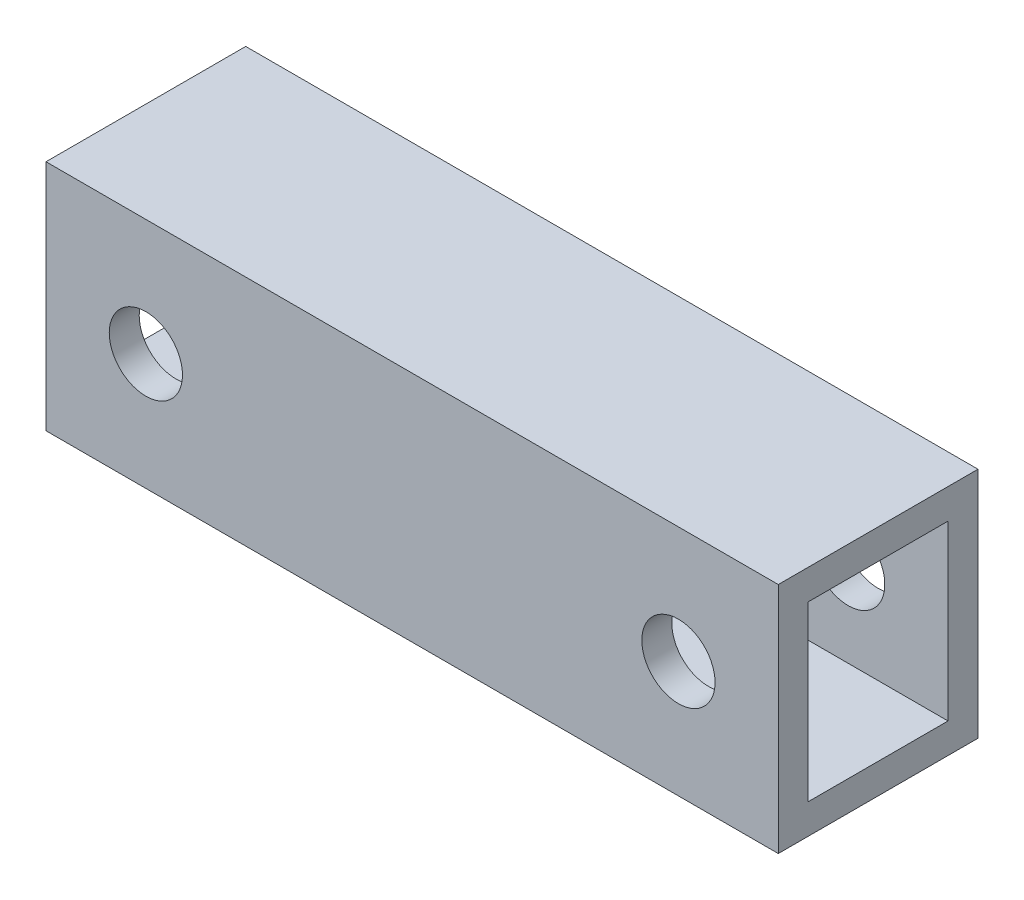
ISO-10303-21;
HEADER;
FILE_DESCRIPTION(('STEP AP214'),'2;1');
FILE_NAME('part.step','',(''),(''),'','','');
FILE_SCHEMA(('AUTOMOTIVE_DESIGN { 1 0 10303 214 1 1 1 1 }'));
ENDSEC;
DATA;
#1=APPLICATION_CONTEXT('core data for automotive mechanical design processes');
#2=APPLICATION_PROTOCOL_DEFINITION('international standard','automotive_design',2000,#1);
#3=PRODUCT_CONTEXT('',#1,'mechanical');
#4=PRODUCT('Part','Part','',(#3));
#5=PRODUCT_RELATED_PRODUCT_CATEGORY('part','',(#4));
#6=PRODUCT_DEFINITION_FORMATION('','',#4);
#7=PRODUCT_DEFINITION_CONTEXT('part definition',#1,'design');
#8=PRODUCT_DEFINITION('design','',#6,#7);
#9=PRODUCT_DEFINITION_SHAPE('','',#8);
#10=(LENGTH_UNIT() NAMED_UNIT(*) SI_UNIT(.MILLI.,.METRE.));
#11=(NAMED_UNIT(*) PLANE_ANGLE_UNIT() SI_UNIT($,.RADIAN.));
#12=(NAMED_UNIT(*) SI_UNIT($,.STERADIAN.) SOLID_ANGLE_UNIT());
#13=UNCERTAINTY_MEASURE_WITH_UNIT(LENGTH_MEASURE(1.E-05),#10,'distance_accuracy_value','');
#14=(GEOMETRIC_REPRESENTATION_CONTEXT(3) GLOBAL_UNCERTAINTY_ASSIGNED_CONTEXT((#13)) GLOBAL_UNIT_ASSIGNED_CONTEXT((#10,
#11,#12)) REPRESENTATION_CONTEXT('',''));
#15=CARTESIAN_POINT('',(0.,0.,0.));
#16=DIRECTION('',(0.,0.,1.));
#17=DIRECTION('',(1.,0.,0.));
#18=AXIS2_PLACEMENT_3D('',#15,#16,#17);
#19=CARTESIAN_POINT('',(54.,-17.,5.));
#20=DIRECTION('',(1.,0.,0.));
#21=DIRECTION('',(0.,0.,-1.));
#22=AXIS2_PLACEMENT_3D('',#19,#20,#21);
#23=PLANE('',#22);
#24=DIRECTION('',(0.,-1.,0.));
#25=VECTOR('',#24,1.);
#26=CARTESIAN_POINT('',(54.,-17.,-1.));
#27=LINE('',#26,#25);
#28=CARTESIAN_POINT('',(54.,-10.,-1.));
#29=VERTEX_POINT('',#28);
#30=CARTESIAN_POINT('',(54.,-17.,-1.));
#31=VERTEX_POINT('',#30);
#32=EDGE_CURVE('E163',#29,#31,#27,.T.);
#33=ORIENTED_EDGE('',*,*,#32,.T.);
#34=DIRECTION('',(0.,0.,-1.));
#35=VECTOR('',#34,1.);
#36=CARTESIAN_POINT('',(54.,-17.,5.));
#37=LINE('',#36,#35);
#38=CARTESIAN_POINT('',(54.,-17.,5.));
#39=VERTEX_POINT('',#38);
#40=EDGE_CURVE('E112',#39,#31,#37,.T.);
#41=ORIENTED_EDGE('',*,*,#40,.F.);
#42=DIRECTION('',(0.,-1.,0.));
#43=VECTOR('',#42,1.);
#44=CARTESIAN_POINT('',(54.,-17.,5.));
#45=LINE('',#44,#43);
#46=CARTESIAN_POINT('',(54.,-10.,5.));
#47=VERTEX_POINT('',#46);
#48=EDGE_CURVE('E164',#47,#39,#45,.T.);
#49=ORIENTED_EDGE('',*,*,#48,.F.);
#50=DIRECTION('',(0.,0.,-1.));
#51=VECTOR('',#50,1.);
#52=CARTESIAN_POINT('',(54.,-10.,5.));
#53=LINE('',#52,#51);
#54=EDGE_CURVE('E173',#47,#29,#53,.T.);
#55=ORIENTED_EDGE('',*,*,#54,.T.);
#56=EDGE_LOOP('',(#33,#41,#49,#55));
#57=FACE_BOUND('',#56,.T.);
#58=DIRECTION('',(0.,1.,0.));
#59=VECTOR('',#58,1.);
#60=CARTESIAN_POINT('',(54.,-17.,4.1));
#61=LINE('',#60,#59);
#62=CARTESIAN_POINT('',(54.,-16.1,4.1));
#63=VERTEX_POINT('',#62);
#64=CARTESIAN_POINT('',(54.,-10.9,4.1));
#65=VERTEX_POINT('',#64);
#66=EDGE_CURVE('E157',#63,#65,#61,.T.);
#67=ORIENTED_EDGE('',*,*,#66,.F.);
#68=DIRECTION('',(0.,0.,1.));
#69=VECTOR('',#68,1.);
#70=CARTESIAN_POINT('',(54.,-16.1,5.));
#71=LINE('',#70,#69);
#72=CARTESIAN_POINT('',(54.,-16.1,-0.1));
#73=VERTEX_POINT('',#72);
#74=EDGE_CURVE('E165',#73,#63,#71,.T.);
#75=ORIENTED_EDGE('',*,*,#74,.F.);
#76=DIRECTION('',(0.,1.,0.));
#77=VECTOR('',#76,1.);
#78=CARTESIAN_POINT('',(54.,-17.,-0.1));
#79=LINE('',#78,#77);
#80=CARTESIAN_POINT('',(54.,-10.9,-0.1));
#81=VERTEX_POINT('',#80);
#82=EDGE_CURVE('E156',#73,#81,#79,.T.);
#83=ORIENTED_EDGE('',*,*,#82,.T.);
#84=DIRECTION('',(0.,0.,-1.));
#85=VECTOR('',#84,1.);
#86=CARTESIAN_POINT('',(54.,-10.9,5.));
#87=LINE('',#86,#85);
#88=EDGE_CURVE('E119',#65,#81,#87,.T.);
#89=ORIENTED_EDGE('',*,*,#88,.F.);
#90=EDGE_LOOP('',(#67,#75,#83,#89));
#91=FACE_BOUND('',#90,.T.);
#92=ADVANCED_FACE('F43',(#57,#91),#23,.F.);
#93=CARTESIAN_POINT('',(76.,-17.,5.));
#94=DIRECTION('',(-1.,0.,0.));
#95=DIRECTION('',(0.,0.,1.));
#96=AXIS2_PLACEMENT_3D('',#93,#94,#95);
#97=PLANE('',#96);
#98=DIRECTION('',(0.,1.,0.));
#99=VECTOR('',#98,1.);
#100=CARTESIAN_POINT('',(76.,-17.,-1.));
#101=LINE('',#100,#99);
#102=CARTESIAN_POINT('',(76.,-17.,-1.));
#103=VERTEX_POINT('',#102);
#104=CARTESIAN_POINT('',(76.,-10.,-1.));
#105=VERTEX_POINT('',#104);
#106=EDGE_CURVE('E177',#103,#105,#101,.T.);
#107=ORIENTED_EDGE('',*,*,#106,.T.);
#108=DIRECTION('',(0.,0.,-1.));
#109=VECTOR('',#108,1.);
#110=CARTESIAN_POINT('',(76.,-10.,5.));
#111=LINE('',#110,#109);
#112=CARTESIAN_POINT('',(76.,-10.,5.));
#113=VERTEX_POINT('',#112);
#114=EDGE_CURVE('E183',#113,#105,#111,.T.);
#115=ORIENTED_EDGE('',*,*,#114,.F.);
#116=DIRECTION('',(0.,1.,0.));
#117=VECTOR('',#116,1.);
#118=CARTESIAN_POINT('',(76.,-17.,5.));
#119=LINE('',#118,#117);
#120=CARTESIAN_POINT('',(76.,-17.,5.));
#121=VERTEX_POINT('',#120);
#122=EDGE_CURVE('E172',#121,#113,#119,.T.);
#123=ORIENTED_EDGE('',*,*,#122,.F.);
#124=DIRECTION('',(0.,0.,-1.));
#125=VECTOR('',#124,1.);
#126=CARTESIAN_POINT('',(76.,-17.,5.));
#127=LINE('',#126,#125);
#128=EDGE_CURVE('E189',#121,#103,#127,.T.);
#129=ORIENTED_EDGE('',*,*,#128,.T.);
#130=EDGE_LOOP('',(#107,#115,#123,#129));
#131=FACE_BOUND('',#130,.T.);
#132=DIRECTION('',(0.,-1.,0.));
#133=VECTOR('',#132,1.);
#134=CARTESIAN_POINT('',(76.,-17.,4.1));
#135=LINE('',#134,#133);
#136=CARTESIAN_POINT('',(76.,-10.9,4.1));
#137=VERTEX_POINT('',#136);
#138=CARTESIAN_POINT('',(76.,-16.1,4.1));
#139=VERTEX_POINT('',#138);
#140=EDGE_CURVE('E11',#137,#139,#135,.T.);
#141=ORIENTED_EDGE('',*,*,#140,.F.);
#142=DIRECTION('',(0.,0.,1.));
#143=VECTOR('',#142,1.);
#144=CARTESIAN_POINT('',(76.,-10.9,5.));
#145=LINE('',#144,#143);
#146=CARTESIAN_POINT('',(76.,-10.9,-0.1));
#147=VERTEX_POINT('',#146);
#148=EDGE_CURVE('E109',#147,#137,#145,.T.);
#149=ORIENTED_EDGE('',*,*,#148,.F.);
#150=DIRECTION('',(0.,-1.,0.));
#151=VECTOR('',#150,1.);
#152=CARTESIAN_POINT('',(76.,-17.,-0.1));
#153=LINE('',#152,#151);
#154=CARTESIAN_POINT('',(76.,-16.1,-0.1));
#155=VERTEX_POINT('',#154);
#156=EDGE_CURVE('E104',#147,#155,#153,.T.);
#157=ORIENTED_EDGE('',*,*,#156,.T.);
#158=DIRECTION('',(0.,0.,-1.));
#159=VECTOR('',#158,1.);
#160=CARTESIAN_POINT('',(76.,-16.1,5.));
#161=LINE('',#160,#159);
#162=EDGE_CURVE('E51',#139,#155,#161,.T.);
#163=ORIENTED_EDGE('',*,*,#162,.F.);
#164=EDGE_LOOP('',(#141,#149,#157,#163));
#165=FACE_BOUND('',#164,.T.);
#166=ADVANCED_FACE('F125',(#131,#165),#97,.F.);
#167=CARTESIAN_POINT('',(54.,-17.,5.));
#168=DIRECTION('',(0.,1.,0.));
#169=DIRECTION('',(0.,0.,1.));
#170=AXIS2_PLACEMENT_3D('',#167,#168,#169);
#171=PLANE('',#170);
#172=DIRECTION('',(1.,0.,0.));
#173=VECTOR('',#172,1.);
#174=CARTESIAN_POINT('',(54.,-17.,-1.));
#175=LINE('',#174,#173);
#176=EDGE_CURVE('E180',#31,#103,#175,.T.);
#177=ORIENTED_EDGE('',*,*,#176,.T.);
#178=ORIENTED_EDGE('',*,*,#128,.F.);
#179=DIRECTION('',(1.,0.,0.));
#180=VECTOR('',#179,1.);
#181=CARTESIAN_POINT('',(54.,-17.,5.));
#182=LINE('',#181,#180);
#183=EDGE_CURVE('E169',#39,#121,#182,.T.);
#184=ORIENTED_EDGE('',*,*,#183,.F.);
#185=ORIENTED_EDGE('',*,*,#40,.T.);
#186=EDGE_LOOP('',(#177,#178,#184,#185));
#187=FACE_BOUND('',#186,.T.);
#188=ADVANCED_FACE('F195',(#187),#171,.F.);
#189=CARTESIAN_POINT('',(54.,-10.,5.));
#190=DIRECTION('',(0.,-1.,0.));
#191=DIRECTION('',(0.,0.,-1.));
#192=AXIS2_PLACEMENT_3D('',#189,#190,#191);
#193=PLANE('',#192);
#194=DIRECTION('',(-1.,0.,0.));
#195=VECTOR('',#194,1.);
#196=CARTESIAN_POINT('',(54.,-10.,-1.));
#197=LINE('',#196,#195);
#198=EDGE_CURVE('E166',#105,#29,#197,.T.);
#199=ORIENTED_EDGE('',*,*,#198,.T.);
#200=ORIENTED_EDGE('',*,*,#54,.F.);
#201=DIRECTION('',(-1.,0.,0.));
#202=VECTOR('',#201,1.);
#203=CARTESIAN_POINT('',(54.,-10.,5.));
#204=LINE('',#203,#202);
#205=EDGE_CURVE('E174',#113,#47,#204,.T.);
#206=ORIENTED_EDGE('',*,*,#205,.F.);
#207=ORIENTED_EDGE('',*,*,#114,.T.);
#208=EDGE_LOOP('',(#199,#200,#206,#207));
#209=FACE_BOUND('',#208,.T.);
#210=ADVANCED_FACE('F207',(#209),#193,.F.);
#211=CARTESIAN_POINT('',(0.,0.,5.));
#212=DIRECTION('',(0.,0.,-1.));
#213=DIRECTION('',(-1.,0.,0.));
#214=AXIS2_PLACEMENT_3D('',#211,#212,#213);
#215=PLANE('',#214);
#216=CARTESIAN_POINT('',(57.,-13.5,5.));
#217=DIRECTION('',(0.,0.,1.));
#218=DIRECTION('',(1.,0.,0.));
#219=AXIS2_PLACEMENT_3D('',#216,#217,#218);
#220=CIRCLE('',#219,1.1);
#221=CARTESIAN_POINT('',(58.1,-13.5,5.));
#222=VERTEX_POINT('',#221);
#223=EDGE_CURVE('E128',#222,#222,#220,.T.);
#224=ORIENTED_EDGE('',*,*,#223,.F.);
#225=EDGE_LOOP('',(#224));
#226=FACE_BOUND('',#225,.T.);
#227=CARTESIAN_POINT('',(73.,-13.5,5.));
#228=DIRECTION('',(0.,0.,1.));
#229=DIRECTION('',(1.,0.,0.));
#230=AXIS2_PLACEMENT_3D('',#227,#228,#229);
#231=CIRCLE('',#230,1.1);
#232=CARTESIAN_POINT('',(74.1,-13.5,5.));
#233=VERTEX_POINT('',#232);
#234=EDGE_CURVE('E136',#233,#233,#231,.T.);
#235=ORIENTED_EDGE('',*,*,#234,.F.);
#236=EDGE_LOOP('',(#235));
#237=FACE_BOUND('',#236,.T.);
#238=ORIENTED_EDGE('',*,*,#48,.T.);
#239=ORIENTED_EDGE('',*,*,#183,.T.);
#240=ORIENTED_EDGE('',*,*,#122,.T.);
#241=ORIENTED_EDGE('',*,*,#205,.T.);
#242=EDGE_LOOP('',(#238,#239,#240,#241));
#243=FACE_BOUND('',#242,.T.);
#244=ADVANCED_FACE('F211',(#226,#237,#243),#215,.F.);
#245=CARTESIAN_POINT('',(0.,0.,-1.));
#246=DIRECTION('',(0.,0.,-1.));
#247=DIRECTION('',(-1.,0.,0.));
#248=AXIS2_PLACEMENT_3D('',#245,#246,#247);
#249=PLANE('',#248);
#250=CARTESIAN_POINT('',(57.,-13.5,-1.));
#251=DIRECTION('',(0.,0.,-1.));
#252=DIRECTION('',(-1.,0.,0.));
#253=AXIS2_PLACEMENT_3D('',#250,#251,#252);
#254=CIRCLE('',#253,1.1);
#255=CARTESIAN_POINT('',(55.9,-13.5,-1.));
#256=VERTEX_POINT('',#255);
#257=EDGE_CURVE('E149',#256,#256,#254,.F.);
#258=ORIENTED_EDGE('',*,*,#257,.T.);
#259=EDGE_LOOP('',(#258));
#260=FACE_BOUND('',#259,.T.);
#261=CARTESIAN_POINT('',(73.,-13.5,-1.));
#262=DIRECTION('',(0.,0.,-1.));
#263=DIRECTION('',(-1.,0.,0.));
#264=AXIS2_PLACEMENT_3D('',#261,#262,#263);
#265=CIRCLE('',#264,1.1);
#266=CARTESIAN_POINT('',(71.9,-13.5,-1.));
#267=VERTEX_POINT('',#266);
#268=EDGE_CURVE('E131',#267,#267,#265,.F.);
#269=ORIENTED_EDGE('',*,*,#268,.T.);
#270=EDGE_LOOP('',(#269));
#271=FACE_BOUND('',#270,.T.);
#272=ORIENTED_EDGE('',*,*,#32,.F.);
#273=ORIENTED_EDGE('',*,*,#198,.F.);
#274=ORIENTED_EDGE('',*,*,#106,.F.);
#275=ORIENTED_EDGE('',*,*,#176,.F.);
#276=EDGE_LOOP('',(#272,#273,#274,#275));
#277=FACE_BOUND('',#276,.T.);
#278=ADVANCED_FACE('F205',(#260,#271,#277),#249,.T.);
#279=CARTESIAN_POINT('',(53.,-16.1,4.1));
#280=DIRECTION('',(0.,1.,0.));
#281=DIRECTION('',(0.,0.,1.));
#282=AXIS2_PLACEMENT_3D('',#279,#280,#281);
#283=PLANE('',#282);
#284=ORIENTED_EDGE('',*,*,#74,.T.);
#285=DIRECTION('',(1.,0.,0.));
#286=VECTOR('',#285,1.);
#287=CARTESIAN_POINT('',(53.,-16.1,4.1));
#288=LINE('',#287,#286);
#289=EDGE_CURVE('E118',#63,#139,#288,.T.);
#290=ORIENTED_EDGE('',*,*,#289,.T.);
#291=ORIENTED_EDGE('',*,*,#162,.T.);
#292=DIRECTION('',(1.,0.,0.));
#293=VECTOR('',#292,1.);
#294=CARTESIAN_POINT('',(53.,-16.1,-0.1));
#295=LINE('',#294,#293);
#296=EDGE_CURVE('E61',#73,#155,#295,.T.);
#297=ORIENTED_EDGE('',*,*,#296,.F.);
#298=EDGE_LOOP('',(#284,#290,#291,#297));
#299=FACE_BOUND('',#298,.T.);
#300=ADVANCED_FACE('F218',(#299),#283,.T.);
#301=CARTESIAN_POINT('',(53.,-10.9,4.1));
#302=DIRECTION('',(0.,-1.,0.));
#303=DIRECTION('',(0.,0.,-1.));
#304=AXIS2_PLACEMENT_3D('',#301,#302,#303);
#305=PLANE('',#304);
#306=ORIENTED_EDGE('',*,*,#88,.T.);
#307=DIRECTION('',(-1.,0.,0.));
#308=VECTOR('',#307,1.);
#309=CARTESIAN_POINT('',(53.,-10.9,-0.1));
#310=LINE('',#309,#308);
#311=EDGE_CURVE('E56',#147,#81,#310,.T.);
#312=ORIENTED_EDGE('',*,*,#311,.F.);
#313=ORIENTED_EDGE('',*,*,#148,.T.);
#314=DIRECTION('',(-1.,0.,0.));
#315=VECTOR('',#314,1.);
#316=CARTESIAN_POINT('',(53.,-10.9,4.1));
#317=LINE('',#316,#315);
#318=EDGE_CURVE('E152',#137,#65,#317,.T.);
#319=ORIENTED_EDGE('',*,*,#318,.T.);
#320=EDGE_LOOP('',(#306,#312,#313,#319));
#321=FACE_BOUND('',#320,.T.);
#322=ADVANCED_FACE('F111',(#321),#305,.T.);
#323=CARTESIAN_POINT('',(0.,0.,4.1));
#324=DIRECTION('',(0.,0.,-1.));
#325=DIRECTION('',(-1.,0.,0.));
#326=AXIS2_PLACEMENT_3D('',#323,#324,#325);
#327=PLANE('',#326);
#328=CARTESIAN_POINT('',(57.,-13.5,4.1));
#329=DIRECTION('',(0.,0.,-1.));
#330=DIRECTION('',(-1.,0.,0.));
#331=AXIS2_PLACEMENT_3D('',#328,#329,#330);
#332=CIRCLE('',#331,1.1);
#333=CARTESIAN_POINT('',(55.9,-13.5,4.1));
#334=VERTEX_POINT('',#333);
#335=EDGE_CURVE('E148',#334,#334,#332,.F.);
#336=ORIENTED_EDGE('',*,*,#335,.T.);
#337=EDGE_LOOP('',(#336));
#338=FACE_BOUND('',#337,.T.);
#339=CARTESIAN_POINT('',(73.,-13.5,4.1));
#340=DIRECTION('',(0.,0.,-1.));
#341=DIRECTION('',(-1.,0.,0.));
#342=AXIS2_PLACEMENT_3D('',#339,#340,#341);
#343=CIRCLE('',#342,1.1);
#344=CARTESIAN_POINT('',(71.9,-13.5,4.1));
#345=VERTEX_POINT('',#344);
#346=EDGE_CURVE('E129',#345,#345,#343,.F.);
#347=ORIENTED_EDGE('',*,*,#346,.T.);
#348=EDGE_LOOP('',(#347));
#349=FACE_BOUND('',#348,.T.);
#350=ORIENTED_EDGE('',*,*,#66,.T.);
#351=ORIENTED_EDGE('',*,*,#318,.F.);
#352=ORIENTED_EDGE('',*,*,#140,.T.);
#353=ORIENTED_EDGE('',*,*,#289,.F.);
#354=EDGE_LOOP('',(#350,#351,#352,#353));
#355=FACE_BOUND('',#354,.T.);
#356=ADVANCED_FACE('F280',(#338,#349,#355),#327,.T.);
#357=CARTESIAN_POINT('',(0.,0.,-0.1));
#358=DIRECTION('',(0.,0.,-1.));
#359=DIRECTION('',(-1.,0.,0.));
#360=AXIS2_PLACEMENT_3D('',#357,#358,#359);
#361=PLANE('',#360);
#362=CARTESIAN_POINT('',(57.,-13.5,-0.1));
#363=DIRECTION('',(0.,0.,-1.));
#364=DIRECTION('',(-1.,0.,0.));
#365=AXIS2_PLACEMENT_3D('',#362,#363,#364);
#366=CIRCLE('',#365,1.1);
#367=CARTESIAN_POINT('',(55.9,-13.5,-0.1));
#368=VERTEX_POINT('',#367);
#369=EDGE_CURVE('E46',#368,#368,#366,.F.);
#370=ORIENTED_EDGE('',*,*,#369,.F.);
#371=EDGE_LOOP('',(#370));
#372=FACE_BOUND('',#371,.T.);
#373=CARTESIAN_POINT('',(73.,-13.5,-0.1));
#374=DIRECTION('',(0.,0.,-1.));
#375=DIRECTION('',(-1.,0.,0.));
#376=AXIS2_PLACEMENT_3D('',#373,#374,#375);
#377=CIRCLE('',#376,1.1);
#378=CARTESIAN_POINT('',(71.9,-13.5,-0.1));
#379=VERTEX_POINT('',#378);
#380=EDGE_CURVE('E130',#379,#379,#377,.F.);
#381=ORIENTED_EDGE('',*,*,#380,.F.);
#382=EDGE_LOOP('',(#381));
#383=FACE_BOUND('',#382,.T.);
#384=ORIENTED_EDGE('',*,*,#296,.T.);
#385=ORIENTED_EDGE('',*,*,#156,.F.);
#386=ORIENTED_EDGE('',*,*,#311,.T.);
#387=ORIENTED_EDGE('',*,*,#82,.F.);
#388=EDGE_LOOP('',(#384,#385,#386,#387));
#389=FACE_BOUND('',#388,.T.);
#390=ADVANCED_FACE('F106',(#372,#383,#389),#361,.F.);
#391=CARTESIAN_POINT('',(73.,-13.5,5.));
#392=DIRECTION('',(0.,0.,-1.));
#393=DIRECTION('',(-1.,0.,0.));
#394=AXIS2_PLACEMENT_3D('',#391,#392,#393);
#395=CYLINDRICAL_SURFACE('',#394,1.1);
#396=ORIENTED_EDGE('',*,*,#268,.F.);
#397=EDGE_LOOP('',(#396));
#398=FACE_BOUND('',#397,.T.);
#399=ORIENTED_EDGE('',*,*,#380,.T.);
#400=EDGE_LOOP('',(#399));
#401=FACE_BOUND('',#400,.T.);
#402=ADVANCED_FACE('F294',(#398,#401),#395,.F.);
#403=CARTESIAN_POINT('',(57.,-13.5,5.));
#404=DIRECTION('',(0.,0.,-1.));
#405=DIRECTION('',(-1.,0.,0.));
#406=AXIS2_PLACEMENT_3D('',#403,#404,#405);
#407=CYLINDRICAL_SURFACE('',#406,1.1);
#408=ORIENTED_EDGE('',*,*,#257,.F.);
#409=EDGE_LOOP('',(#408));
#410=FACE_BOUND('',#409,.T.);
#411=ORIENTED_EDGE('',*,*,#369,.T.);
#412=EDGE_LOOP('',(#411));
#413=FACE_BOUND('',#412,.T.);
#414=ADVANCED_FACE('F303',(#410,#413),#407,.F.);
#415=ORIENTED_EDGE('',*,*,#346,.F.);
#416=EDGE_LOOP('',(#415));
#417=FACE_BOUND('',#416,.T.);
#418=ORIENTED_EDGE('',*,*,#234,.T.);
#419=EDGE_LOOP('',(#418));
#420=FACE_BOUND('',#419,.T.);
#421=ADVANCED_FACE('F307',(#417,#420),#395,.F.);
#422=ORIENTED_EDGE('',*,*,#335,.F.);
#423=EDGE_LOOP('',(#422));
#424=FACE_BOUND('',#423,.T.);
#425=ORIENTED_EDGE('',*,*,#223,.T.);
#426=EDGE_LOOP('',(#425));
#427=FACE_BOUND('',#426,.T.);
#428=ADVANCED_FACE('F320',(#424,#427),#407,.F.);
#429=CLOSED_SHELL('',(#92,#166,#188,#210,#244,#278,#300,#322,#356,#390,#402,#414,#421,#428));
#430=MANIFOLD_SOLID_BREP('B2',#429);
#431=ADVANCED_BREP_SHAPE_REPRESENTATION('',(#18,#430),#14);
#432=SHAPE_DEFINITION_REPRESENTATION(#9,#431);
ENDSEC;
END-ISO-10303-21;
